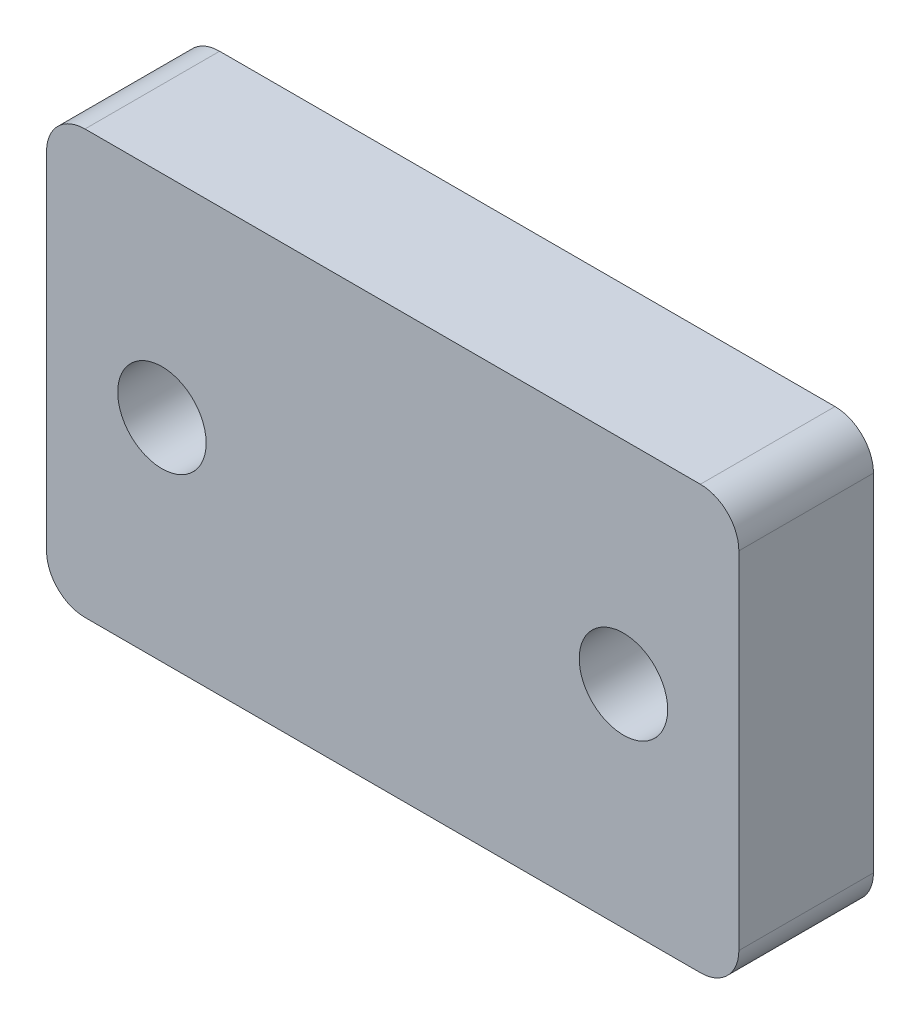
ISO-10303-21;
HEADER;
FILE_DESCRIPTION(('STEP AP214'),'2;1');
FILE_NAME('part.step','',(''),(''),'','','');
FILE_SCHEMA(('AUTOMOTIVE_DESIGN { 1 0 10303 214 1 1 1 1 }'));
ENDSEC;
DATA;
#1=APPLICATION_CONTEXT('core data for automotive mechanical design processes');
#2=APPLICATION_PROTOCOL_DEFINITION('international standard','automotive_design',2000,#1);
#3=PRODUCT_CONTEXT('',#1,'mechanical');
#4=PRODUCT('Part','Part','',(#3));
#5=PRODUCT_RELATED_PRODUCT_CATEGORY('part','',(#4));
#6=PRODUCT_DEFINITION_FORMATION('','',#4);
#7=PRODUCT_DEFINITION_CONTEXT('part definition',#1,'design');
#8=PRODUCT_DEFINITION('design','',#6,#7);
#9=PRODUCT_DEFINITION_SHAPE('','',#8);
#10=(LENGTH_UNIT() NAMED_UNIT(*) SI_UNIT(.MILLI.,.METRE.));
#11=(NAMED_UNIT(*) PLANE_ANGLE_UNIT() SI_UNIT($,.RADIAN.));
#12=(NAMED_UNIT(*) SI_UNIT($,.STERADIAN.) SOLID_ANGLE_UNIT());
#13=UNCERTAINTY_MEASURE_WITH_UNIT(LENGTH_MEASURE(1.E-05),#10,'distance_accuracy_value','');
#14=(GEOMETRIC_REPRESENTATION_CONTEXT(3) GLOBAL_UNCERTAINTY_ASSIGNED_CONTEXT((#13)) GLOBAL_UNIT_ASSIGNED_CONTEXT((#10,
#11,#12)) REPRESENTATION_CONTEXT('',''));
#15=CARTESIAN_POINT('',(0.,0.,0.));
#16=DIRECTION('',(0.,0.,1.));
#17=DIRECTION('',(1.,0.,0.));
#18=AXIS2_PLACEMENT_3D('',#15,#16,#17);
#19=CARTESIAN_POINT('',(0.,0.,3.5));
#20=DIRECTION('',(0.,0.,-1.));
#21=DIRECTION('',(-1.,0.,0.));
#22=AXIS2_PLACEMENT_3D('',#19,#20,#21);
#23=PLANE('',#22);
#24=DIRECTION('',(0.,1.,0.));
#25=VECTOR('',#24,1.);
#26=CARTESIAN_POINT('',(18.,0.,3.5));
#27=LINE('',#26,#25);
#28=CARTESIAN_POINT('',(18.,1.,3.5));
#29=VERTEX_POINT('',#28);
#30=CARTESIAN_POINT('',(18.,10.,3.5));
#31=VERTEX_POINT('',#30);
#32=EDGE_CURVE('E169',#29,#31,#27,.T.);
#33=ORIENTED_EDGE('',*,*,#32,.T.);
#34=CARTESIAN_POINT('',(17.,10.,3.5));
#35=DIRECTION('',(0.,0.,-1.));
#36=DIRECTION('',(-1.,0.,0.));
#37=AXIS2_PLACEMENT_3D('',#34,#35,#36);
#38=CIRCLE('',#37,1.);
#39=CARTESIAN_POINT('',(17.,11.,3.5));
#40=VERTEX_POINT('',#39);
#41=EDGE_CURVE('E152',#31,#40,#38,.F.);
#42=ORIENTED_EDGE('',*,*,#41,.T.);
#43=DIRECTION('',(-1.,0.,0.));
#44=VECTOR('',#43,1.);
#45=CARTESIAN_POINT('',(0.,11.,3.5));
#46=LINE('',#45,#44);
#47=CARTESIAN_POINT('',(1.,11.,3.5));
#48=VERTEX_POINT('',#47);
#49=EDGE_CURVE('E123',#40,#48,#46,.T.);
#50=ORIENTED_EDGE('',*,*,#49,.T.);
#51=CARTESIAN_POINT('',(1.,10.,3.5));
#52=DIRECTION('',(0.,0.,-1.));
#53=DIRECTION('',(-1.,0.,0.));
#54=AXIS2_PLACEMENT_3D('',#51,#52,#53);
#55=CIRCLE('',#54,1.);
#56=CARTESIAN_POINT('',(0.,10.,3.5));
#57=VERTEX_POINT('',#56);
#58=EDGE_CURVE('E150',#48,#57,#55,.F.);
#59=ORIENTED_EDGE('',*,*,#58,.T.);
#60=DIRECTION('',(0.,-1.,0.));
#61=VECTOR('',#60,1.);
#62=CARTESIAN_POINT('',(0.,0.,3.5));
#63=LINE('',#62,#61);
#64=CARTESIAN_POINT('',(0.,1.,3.5));
#65=VERTEX_POINT('',#64);
#66=EDGE_CURVE('E130',#57,#65,#63,.T.);
#67=ORIENTED_EDGE('',*,*,#66,.T.);
#68=CARTESIAN_POINT('',(1.,1.,3.5));
#69=DIRECTION('',(0.,0.,-1.));
#70=DIRECTION('',(-1.,0.,0.));
#71=AXIS2_PLACEMENT_3D('',#68,#69,#70);
#72=CIRCLE('',#71,1.);
#73=CARTESIAN_POINT('',(1.,0.,3.5));
#74=VERTEX_POINT('',#73);
#75=EDGE_CURVE('E58',#65,#74,#72,.F.);
#76=ORIENTED_EDGE('',*,*,#75,.T.);
#77=DIRECTION('',(1.,0.,0.));
#78=VECTOR('',#77,1.);
#79=CARTESIAN_POINT('',(0.,0.,3.5));
#80=LINE('',#79,#78);
#81=CARTESIAN_POINT('',(17.,0.,3.5));
#82=VERTEX_POINT('',#81);
#83=EDGE_CURVE('E133',#74,#82,#80,.T.);
#84=ORIENTED_EDGE('',*,*,#83,.T.);
#85=CARTESIAN_POINT('',(17.,1.,3.5));
#86=DIRECTION('',(0.,0.,-1.));
#87=DIRECTION('',(-1.,0.,0.));
#88=AXIS2_PLACEMENT_3D('',#85,#86,#87);
#89=CIRCLE('',#88,1.);
#90=EDGE_CURVE('E148',#82,#29,#89,.F.);
#91=ORIENTED_EDGE('',*,*,#90,.T.);
#92=EDGE_LOOP('',(#33,#42,#50,#59,#67,#76,#84,#91));
#93=FACE_BOUND('',#92,.T.);
#94=CARTESIAN_POINT('',(3.,5.5,3.5));
#95=DIRECTION('',(0.,0.,1.));
#96=DIRECTION('',(1.,0.,0.));
#97=AXIS2_PLACEMENT_3D('',#94,#95,#96);
#98=CIRCLE('',#97,1.15);
#99=CARTESIAN_POINT('',(4.15,5.5,3.5));
#100=VERTEX_POINT('',#99);
#101=EDGE_CURVE('E165',#100,#100,#98,.T.);
#102=ORIENTED_EDGE('',*,*,#101,.F.);
#103=EDGE_LOOP('',(#102));
#104=FACE_BOUND('',#103,.T.);
#105=CARTESIAN_POINT('',(15.,5.5,3.5));
#106=DIRECTION('',(0.,0.,1.));
#107=DIRECTION('',(1.,0.,0.));
#108=AXIS2_PLACEMENT_3D('',#105,#106,#107);
#109=CIRCLE('',#108,1.15);
#110=CARTESIAN_POINT('',(16.15,5.5,3.5));
#111=VERTEX_POINT('',#110);
#112=EDGE_CURVE('E176',#111,#111,#109,.T.);
#113=ORIENTED_EDGE('',*,*,#112,.F.);
#114=EDGE_LOOP('',(#113));
#115=FACE_BOUND('',#114,.T.);
#116=ADVANCED_FACE('F38',(#93,#104,#115),#23,.F.);
#117=CARTESIAN_POINT('',(0.,0.,0.));
#118=DIRECTION('',(0.,0.,-1.));
#119=DIRECTION('',(-1.,0.,0.));
#120=AXIS2_PLACEMENT_3D('',#117,#118,#119);
#121=PLANE('',#120);
#122=CARTESIAN_POINT('',(3.,5.5,0.));
#123=DIRECTION('',(0.,0.,1.));
#124=DIRECTION('',(1.,0.,0.));
#125=AXIS2_PLACEMENT_3D('',#122,#123,#124);
#126=CIRCLE('',#125,1.15);
#127=CARTESIAN_POINT('',(4.15,5.5,0.));
#128=VERTEX_POINT('',#127);
#129=EDGE_CURVE('E173',#128,#128,#126,.T.);
#130=ORIENTED_EDGE('',*,*,#129,.T.);
#131=EDGE_LOOP('',(#130));
#132=FACE_BOUND('',#131,.T.);
#133=DIRECTION('',(-1.,0.,0.));
#134=VECTOR('',#133,1.);
#135=CARTESIAN_POINT('',(0.,11.,0.));
#136=LINE('',#135,#134);
#137=CARTESIAN_POINT('',(17.,11.,0.));
#138=VERTEX_POINT('',#137);
#139=CARTESIAN_POINT('',(1.,11.,0.));
#140=VERTEX_POINT('',#139);
#141=EDGE_CURVE('E120',#138,#140,#136,.T.);
#142=ORIENTED_EDGE('',*,*,#141,.F.);
#143=CARTESIAN_POINT('',(17.,10.,0.));
#144=DIRECTION('',(0.,0.,-1.));
#145=DIRECTION('',(-1.,0.,0.));
#146=AXIS2_PLACEMENT_3D('',#143,#144,#145);
#147=CIRCLE('',#146,1.);
#148=CARTESIAN_POINT('',(18.,10.,0.));
#149=VERTEX_POINT('',#148);
#150=EDGE_CURVE('E103',#138,#149,#147,.T.);
#151=ORIENTED_EDGE('',*,*,#150,.T.);
#152=DIRECTION('',(0.,1.,0.));
#153=VECTOR('',#152,1.);
#154=CARTESIAN_POINT('',(18.,0.,0.));
#155=LINE('',#154,#153);
#156=CARTESIAN_POINT('',(18.,1.,0.));
#157=VERTEX_POINT('',#156);
#158=EDGE_CURVE('E131',#157,#149,#155,.T.);
#159=ORIENTED_EDGE('',*,*,#158,.F.);
#160=CARTESIAN_POINT('',(17.,1.,0.));
#161=DIRECTION('',(0.,0.,-1.));
#162=DIRECTION('',(-1.,0.,0.));
#163=AXIS2_PLACEMENT_3D('',#160,#161,#162);
#164=CIRCLE('',#163,1.);
#165=CARTESIAN_POINT('',(17.,0.,0.));
#166=VERTEX_POINT('',#165);
#167=EDGE_CURVE('E141',#157,#166,#164,.T.);
#168=ORIENTED_EDGE('',*,*,#167,.T.);
#169=DIRECTION('',(1.,0.,0.));
#170=VECTOR('',#169,1.);
#171=CARTESIAN_POINT('',(0.,0.,0.));
#172=LINE('',#171,#170);
#173=CARTESIAN_POINT('',(1.,0.,0.));
#174=VERTEX_POINT('',#173);
#175=EDGE_CURVE('E135',#174,#166,#172,.T.);
#176=ORIENTED_EDGE('',*,*,#175,.F.);
#177=CARTESIAN_POINT('',(1.,1.,0.));
#178=DIRECTION('',(0.,0.,-1.));
#179=DIRECTION('',(-1.,0.,0.));
#180=AXIS2_PLACEMENT_3D('',#177,#178,#179);
#181=CIRCLE('',#180,1.);
#182=CARTESIAN_POINT('',(0.,1.,0.));
#183=VERTEX_POINT('',#182);
#184=EDGE_CURVE('E124',#174,#183,#181,.T.);
#185=ORIENTED_EDGE('',*,*,#184,.T.);
#186=DIRECTION('',(0.,-1.,0.));
#187=VECTOR('',#186,1.);
#188=CARTESIAN_POINT('',(0.,0.,0.));
#189=LINE('',#188,#187);
#190=CARTESIAN_POINT('',(0.,10.,0.));
#191=VERTEX_POINT('',#190);
#192=EDGE_CURVE('E164',#191,#183,#189,.T.);
#193=ORIENTED_EDGE('',*,*,#192,.F.);
#194=CARTESIAN_POINT('',(1.,10.,0.));
#195=DIRECTION('',(0.,0.,-1.));
#196=DIRECTION('',(-1.,0.,0.));
#197=AXIS2_PLACEMENT_3D('',#194,#195,#196);
#198=CIRCLE('',#197,1.);
#199=EDGE_CURVE('E114',#191,#140,#198,.T.);
#200=ORIENTED_EDGE('',*,*,#199,.T.);
#201=EDGE_LOOP('',(#142,#151,#159,#168,#176,#185,#193,#200));
#202=FACE_BOUND('',#201,.T.);
#203=CARTESIAN_POINT('',(15.,5.5,0.));
#204=DIRECTION('',(0.,0.,1.));
#205=DIRECTION('',(1.,0.,0.));
#206=AXIS2_PLACEMENT_3D('',#203,#204,#205);
#207=CIRCLE('',#206,1.15);
#208=CARTESIAN_POINT('',(16.15,5.5,0.));
#209=VERTEX_POINT('',#208);
#210=EDGE_CURVE('E179',#209,#209,#207,.T.);
#211=ORIENTED_EDGE('',*,*,#210,.T.);
#212=EDGE_LOOP('',(#211));
#213=FACE_BOUND('',#212,.T.);
#214=ADVANCED_FACE('F127',(#132,#202,#213),#121,.T.);
#215=CARTESIAN_POINT('',(0.,0.,3.5));
#216=DIRECTION('',(1.,0.,0.));
#217=DIRECTION('',(0.,0.,-1.));
#218=AXIS2_PLACEMENT_3D('',#215,#216,#217);
#219=PLANE('',#218);
#220=ORIENTED_EDGE('',*,*,#66,.F.);
#221=DIRECTION('',(0.,0.,-1.));
#222=VECTOR('',#221,1.);
#223=CARTESIAN_POINT('',(0.,10.,3.5));
#224=LINE('',#223,#222);
#225=EDGE_CURVE('E156',#57,#191,#224,.T.);
#226=ORIENTED_EDGE('',*,*,#225,.T.);
#227=ORIENTED_EDGE('',*,*,#192,.T.);
#228=DIRECTION('',(0.,0.,-1.));
#229=VECTOR('',#228,1.);
#230=CARTESIAN_POINT('',(0.,1.,3.5));
#231=LINE('',#230,#229);
#232=EDGE_CURVE('E154',#183,#65,#231,.F.);
#233=ORIENTED_EDGE('',*,*,#232,.T.);
#234=EDGE_LOOP('',(#220,#226,#227,#233));
#235=FACE_BOUND('',#234,.T.);
#236=ADVANCED_FACE('F193',(#235),#219,.F.);
#237=CARTESIAN_POINT('',(0.,0.,3.5));
#238=DIRECTION('',(0.,1.,0.));
#239=DIRECTION('',(0.,0.,1.));
#240=AXIS2_PLACEMENT_3D('',#237,#238,#239);
#241=PLANE('',#240);
#242=ORIENTED_EDGE('',*,*,#175,.T.);
#243=DIRECTION('',(0.,0.,-1.));
#244=VECTOR('',#243,1.);
#245=CARTESIAN_POINT('',(17.,0.,3.5));
#246=LINE('',#245,#244);
#247=EDGE_CURVE('E11',#166,#82,#246,.F.);
#248=ORIENTED_EDGE('',*,*,#247,.T.);
#249=ORIENTED_EDGE('',*,*,#83,.F.);
#250=DIRECTION('',(0.,0.,-1.));
#251=VECTOR('',#250,1.);
#252=CARTESIAN_POINT('',(1.,0.,3.5));
#253=LINE('',#252,#251);
#254=EDGE_CURVE('E46',#74,#174,#253,.T.);
#255=ORIENTED_EDGE('',*,*,#254,.T.);
#256=EDGE_LOOP('',(#242,#248,#249,#255));
#257=FACE_BOUND('',#256,.T.);
#258=ADVANCED_FACE('F161',(#257),#241,.F.);
#259=CARTESIAN_POINT('',(18.,0.,3.5));
#260=DIRECTION('',(-1.,0.,0.));
#261=DIRECTION('',(0.,0.,1.));
#262=AXIS2_PLACEMENT_3D('',#259,#260,#261);
#263=PLANE('',#262);
#264=ORIENTED_EDGE('',*,*,#158,.T.);
#265=DIRECTION('',(0.,0.,-1.));
#266=VECTOR('',#265,1.);
#267=CARTESIAN_POINT('',(18.,10.,3.5));
#268=LINE('',#267,#266);
#269=EDGE_CURVE('E108',#149,#31,#268,.F.);
#270=ORIENTED_EDGE('',*,*,#269,.T.);
#271=ORIENTED_EDGE('',*,*,#32,.F.);
#272=DIRECTION('',(0.,0.,-1.));
#273=VECTOR('',#272,1.);
#274=CARTESIAN_POINT('',(18.,1.,3.5));
#275=LINE('',#274,#273);
#276=EDGE_CURVE('E113',#29,#157,#275,.T.);
#277=ORIENTED_EDGE('',*,*,#276,.T.);
#278=EDGE_LOOP('',(#264,#270,#271,#277));
#279=FACE_BOUND('',#278,.T.);
#280=ADVANCED_FACE('F204',(#279),#263,.F.);
#281=CARTESIAN_POINT('',(0.,11.,3.5));
#282=DIRECTION('',(0.,-1.,0.));
#283=DIRECTION('',(0.,0.,-1.));
#284=AXIS2_PLACEMENT_3D('',#281,#282,#283);
#285=PLANE('',#284);
#286=ORIENTED_EDGE('',*,*,#49,.F.);
#287=DIRECTION('',(0.,0.,-1.));
#288=VECTOR('',#287,1.);
#289=CARTESIAN_POINT('',(17.,11.,3.5));
#290=LINE('',#289,#288);
#291=EDGE_CURVE('E107',#40,#138,#290,.T.);
#292=ORIENTED_EDGE('',*,*,#291,.T.);
#293=ORIENTED_EDGE('',*,*,#141,.T.);
#294=DIRECTION('',(0.,0.,-1.));
#295=VECTOR('',#294,1.);
#296=CARTESIAN_POINT('',(1.,11.,3.5));
#297=LINE('',#296,#295);
#298=EDGE_CURVE('E125',#140,#48,#297,.F.);
#299=ORIENTED_EDGE('',*,*,#298,.T.);
#300=EDGE_LOOP('',(#286,#292,#293,#299));
#301=FACE_BOUND('',#300,.T.);
#302=ADVANCED_FACE('F119',(#301),#285,.F.);
#303=CARTESIAN_POINT('',(3.,5.5,3.5));
#304=DIRECTION('',(0.,0.,-1.));
#305=DIRECTION('',(-1.,0.,0.));
#306=AXIS2_PLACEMENT_3D('',#303,#304,#305);
#307=CYLINDRICAL_SURFACE('',#306,1.15);
#308=ORIENTED_EDGE('',*,*,#101,.T.);
#309=EDGE_LOOP('',(#308));
#310=FACE_BOUND('',#309,.T.);
#311=ORIENTED_EDGE('',*,*,#129,.F.);
#312=EDGE_LOOP('',(#311));
#313=FACE_BOUND('',#312,.T.);
#314=ADVANCED_FACE('F198',(#310,#313),#307,.F.);
#315=CARTESIAN_POINT('',(15.,5.5,3.5));
#316=DIRECTION('',(0.,0.,-1.));
#317=DIRECTION('',(-1.,0.,0.));
#318=AXIS2_PLACEMENT_3D('',#315,#316,#317);
#319=CYLINDRICAL_SURFACE('',#318,1.15);
#320=ORIENTED_EDGE('',*,*,#112,.T.);
#321=EDGE_LOOP('',(#320));
#322=FACE_BOUND('',#321,.T.);
#323=ORIENTED_EDGE('',*,*,#210,.F.);
#324=EDGE_LOOP('',(#323));
#325=FACE_BOUND('',#324,.T.);
#326=ADVANCED_FACE('F185',(#322,#325),#319,.F.);
#327=CARTESIAN_POINT('',(17.,10.,3.5));
#328=DIRECTION('',(0.,0.,-1.));
#329=DIRECTION('',(-1.,0.,0.));
#330=AXIS2_PLACEMENT_3D('',#327,#328,#329);
#331=CYLINDRICAL_SURFACE('',#330,1.);
#332=ORIENTED_EDGE('',*,*,#41,.F.);
#333=ORIENTED_EDGE('',*,*,#269,.F.);
#334=ORIENTED_EDGE('',*,*,#150,.F.);
#335=ORIENTED_EDGE('',*,*,#291,.F.);
#336=EDGE_LOOP('',(#332,#333,#334,#335));
#337=FACE_BOUND('',#336,.T.);
#338=ADVANCED_FACE('F106',(#337),#331,.T.);
#339=CARTESIAN_POINT('',(1.,10.,3.5));
#340=DIRECTION('',(0.,0.,-1.));
#341=DIRECTION('',(-1.,0.,0.));
#342=AXIS2_PLACEMENT_3D('',#339,#340,#341);
#343=CYLINDRICAL_SURFACE('',#342,1.);
#344=ORIENTED_EDGE('',*,*,#58,.F.);
#345=ORIENTED_EDGE('',*,*,#298,.F.);
#346=ORIENTED_EDGE('',*,*,#199,.F.);
#347=ORIENTED_EDGE('',*,*,#225,.F.);
#348=EDGE_LOOP('',(#344,#345,#346,#347));
#349=FACE_BOUND('',#348,.T.);
#350=ADVANCED_FACE('F215',(#349),#343,.T.);
#351=CARTESIAN_POINT('',(17.,1.,3.5));
#352=DIRECTION('',(0.,0.,-1.));
#353=DIRECTION('',(-1.,0.,0.));
#354=AXIS2_PLACEMENT_3D('',#351,#352,#353);
#355=CYLINDRICAL_SURFACE('',#354,1.);
#356=ORIENTED_EDGE('',*,*,#90,.F.);
#357=ORIENTED_EDGE('',*,*,#247,.F.);
#358=ORIENTED_EDGE('',*,*,#167,.F.);
#359=ORIENTED_EDGE('',*,*,#276,.F.);
#360=EDGE_LOOP('',(#356,#357,#358,#359));
#361=FACE_BOUND('',#360,.T.);
#362=ADVANCED_FACE('F217',(#361),#355,.T.);
#363=CARTESIAN_POINT('',(1.,1.,3.5));
#364=DIRECTION('',(0.,0.,-1.));
#365=DIRECTION('',(-1.,0.,0.));
#366=AXIS2_PLACEMENT_3D('',#363,#364,#365);
#367=CYLINDRICAL_SURFACE('',#366,1.);
#368=ORIENTED_EDGE('',*,*,#75,.F.);
#369=ORIENTED_EDGE('',*,*,#232,.F.);
#370=ORIENTED_EDGE('',*,*,#184,.F.);
#371=ORIENTED_EDGE('',*,*,#254,.F.);
#372=EDGE_LOOP('',(#368,#369,#370,#371));
#373=FACE_BOUND('',#372,.T.);
#374=ADVANCED_FACE('F40',(#373),#367,.T.);
#375=CLOSED_SHELL('',(#116,#214,#236,#258,#280,#302,#314,#326,#338,#350,#362,#374));
#376=MANIFOLD_SOLID_BREP('B2',#375);
#377=ADVANCED_BREP_SHAPE_REPRESENTATION('',(#18,#376),#14);
#378=SHAPE_DEFINITION_REPRESENTATION(#9,#377);
ENDSEC;
END-ISO-10303-21;
